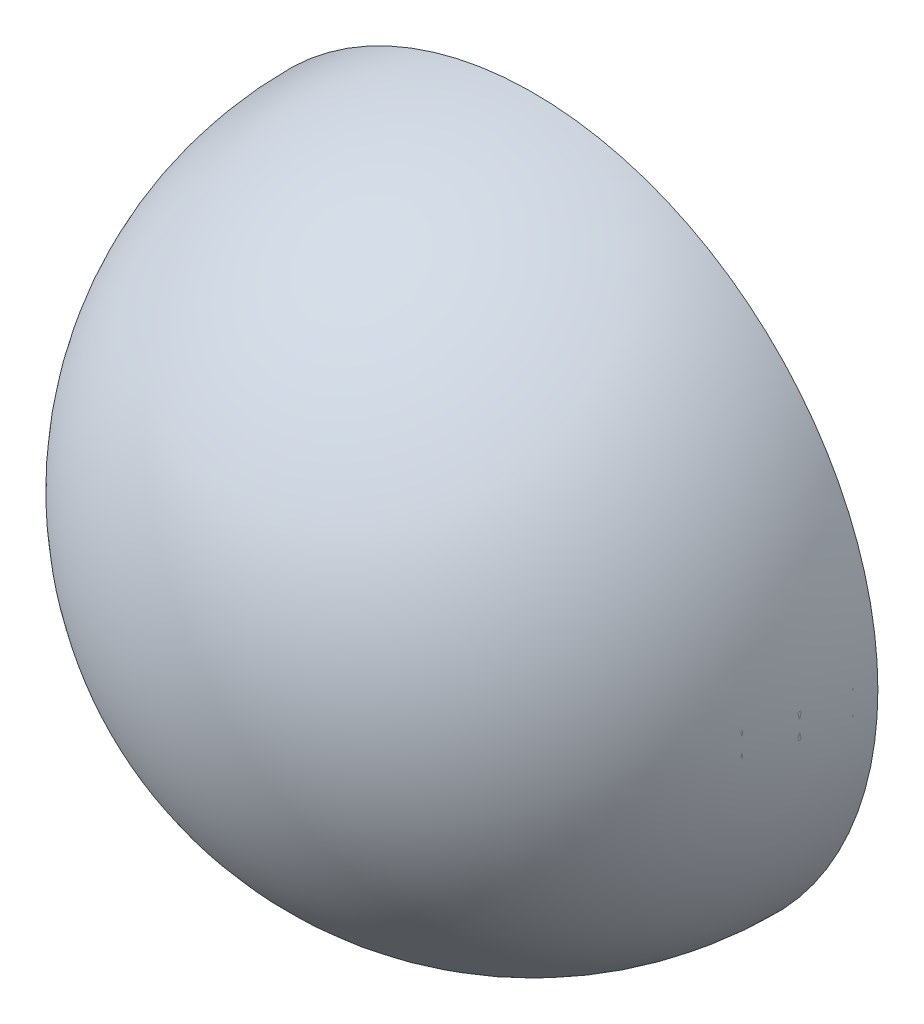
ISO-10303-21;
HEADER;
FILE_DESCRIPTION(('STEP AP214'),'2;1');
FILE_NAME('part.step','',(''),(''),'','','');
FILE_SCHEMA(('AUTOMOTIVE_DESIGN { 1 0 10303 214 1 1 1 1 }'));
ENDSEC;
DATA;
#1=APPLICATION_CONTEXT('core data for automotive mechanical design processes');
#2=APPLICATION_PROTOCOL_DEFINITION('international standard','automotive_design',2000,#1);
#3=PRODUCT_CONTEXT('',#1,'mechanical');
#4=PRODUCT('Part','Part','',(#3));
#5=PRODUCT_RELATED_PRODUCT_CATEGORY('part','',(#4));
#6=PRODUCT_DEFINITION_FORMATION('','',#4);
#7=PRODUCT_DEFINITION_CONTEXT('part definition',#1,'design');
#8=PRODUCT_DEFINITION('design','',#6,#7);
#9=PRODUCT_DEFINITION_SHAPE('','',#8);
#10=(LENGTH_UNIT() NAMED_UNIT(*) SI_UNIT(.MILLI.,.METRE.));
#11=(NAMED_UNIT(*) PLANE_ANGLE_UNIT() SI_UNIT($,.RADIAN.));
#12=(NAMED_UNIT(*) SI_UNIT($,.STERADIAN.) SOLID_ANGLE_UNIT());
#13=UNCERTAINTY_MEASURE_WITH_UNIT(LENGTH_MEASURE(1.E-05),#10,'distance_accuracy_value','');
#14=(GEOMETRIC_REPRESENTATION_CONTEXT(3) GLOBAL_UNCERTAINTY_ASSIGNED_CONTEXT((#13)) GLOBAL_UNIT_ASSIGNED_CONTEXT((#10,
#11,#12)) REPRESENTATION_CONTEXT('',''));
#15=CARTESIAN_POINT('',(0.,0.,0.));
#16=DIRECTION('',(0.,0.,1.));
#17=DIRECTION('',(1.,0.,0.));
#18=AXIS2_PLACEMENT_3D('',#15,#16,#17);
#19=CARTESIAN_POINT('',(0.,0.,0.));
#20=DIRECTION('',(0.,1.,0.));
#21=DIRECTION('',(1.,0.,0.));
#22=AXIS2_PLACEMENT_3D('',#19,#20,#21);
#23=SPHERICAL_SURFACE('',#22,150.);
#24=CARTESIAN_POINT('',(0.,0.,0.));
#25=DIRECTION('',(0.,0.,-1.));
#26=DIRECTION('',(1.,0.,0.));
#27=AXIS2_PLACEMENT_3D('',#24,#25,#26);
#28=SPHERICAL_SURFACE('',#27,150.);
#29=CARTESIAN_POINT('',(0.,0.,0.));
#30=DIRECTION('',(0.,0.,-1.));
#31=DIRECTION('',(1.,0.,0.));
#32=AXIS2_PLACEMENT_3D('',#29,#30,#31);
#33=CIRCLE('',#32,150.);
#34=CARTESIAN_POINT('',(150.,1.04744440165294E-12,1.04744440165294E-12));
#35=VERTEX_POINT('',#34);
#36=EDGE_CURVE('E10',#35,#35,#33,.T.);
#37=ORIENTED_EDGE('',*,*,#36,.F.);
#38=EDGE_LOOP('',(#37));
#39=FACE_BOUND('',#38,.T.);
#40=ADVANCED_FACE('F35',(#39),#28,.T.);
#41=CARTESIAN_POINT('',(0.,0.,0.));
#42=DIRECTION('',(0.,0.,1.));
#43=DIRECTION('',(1.,0.,0.));
#44=AXIS2_PLACEMENT_3D('',#41,#42,#43);
#45=PLANE('',#44);
#46=CARTESIAN_POINT('',(0.,0.,0.));
#47=DIRECTION('',(0.,0.,1.));
#48=DIRECTION('',(1.,0.,0.));
#49=AXIS2_PLACEMENT_3D('',#46,#47,#48);
#50=CIRCLE('',#49,149.9);
#51=CARTESIAN_POINT('',(149.9,0.,1.04674610538517E-12));
#52=VERTEX_POINT('',#51);
#53=EDGE_CURVE('E41',#52,#52,#50,.F.);
#54=ORIENTED_EDGE('',*,*,#53,.F.);
#55=EDGE_LOOP('',(#54));
#56=FACE_BOUND('',#55,.T.);
#57=ORIENTED_EDGE('',*,*,#36,.T.);
#58=EDGE_LOOP('',(#57));
#59=FACE_BOUND('',#58,.T.);
#60=ADVANCED_FACE('F49',(#56,#59),#45,.F.);
#61=CARTESIAN_POINT('',(0.,0.,0.));
#62=DIRECTION('',(0.,1.,0.));
#63=DIRECTION('',(1.,0.,0.));
#64=AXIS2_PLACEMENT_3D('',#61,#62,#63);
#65=SPHERICAL_SURFACE('',#64,149.9);
#66=CARTESIAN_POINT('',(0.,0.,0.));
#67=DIRECTION('',(0.,0.,1.));
#68=DIRECTION('',(1.,0.,0.));
#69=AXIS2_PLACEMENT_3D('',#66,#67,#68);
#70=SPHERICAL_SURFACE('',#69,149.9);
#71=ORIENTED_EDGE('',*,*,#53,.T.);
#72=EDGE_LOOP('',(#71));
#73=FACE_BOUND('',#72,.T.);
#74=ADVANCED_FACE('F47',(#73),#70,.F.);
#75=CLOSED_SHELL('',(#40,#60,#74));
#76=MANIFOLD_SOLID_BREP('B2',#75);
#77=ADVANCED_BREP_SHAPE_REPRESENTATION('',(#18,#76),#14);
#78=SHAPE_DEFINITION_REPRESENTATION(#9,#77);
ENDSEC;
END-ISO-10303-21;
